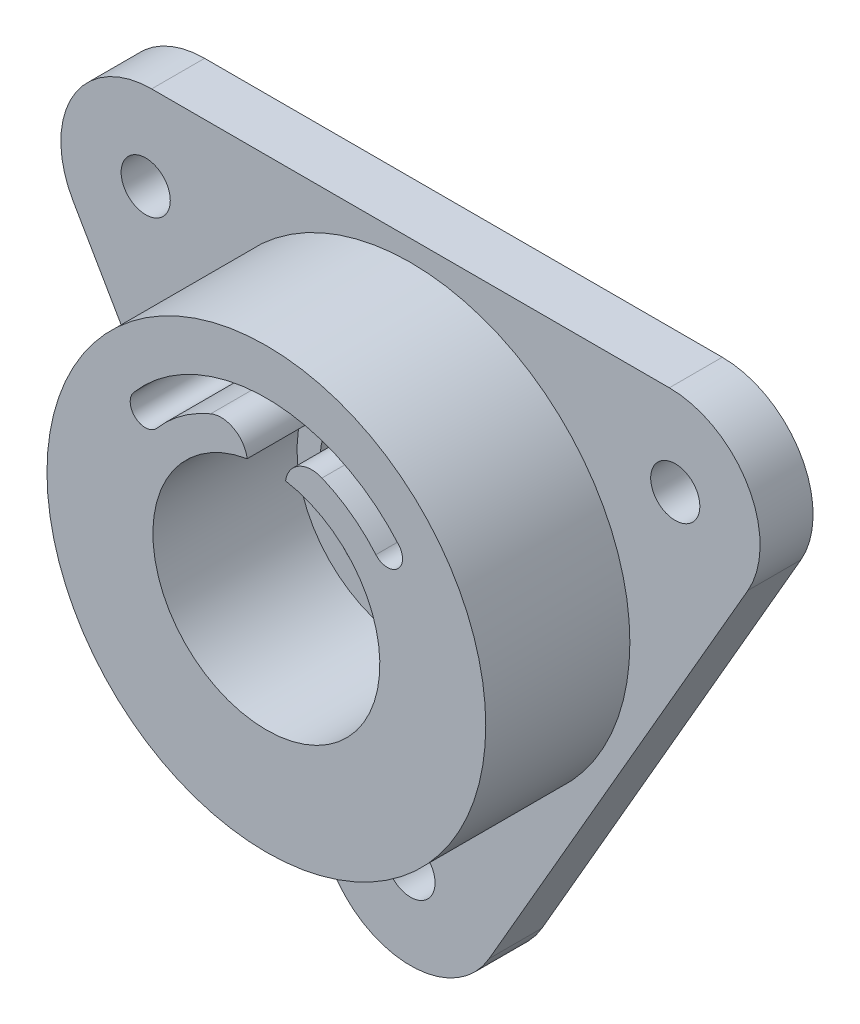
ISO-10303-21;
HEADER;
FILE_DESCRIPTION(('STEP AP214'),'2;1');
FILE_NAME('part.step','',(''),(''),'','','');
FILE_SCHEMA(('AUTOMOTIVE_DESIGN { 1 0 10303 214 1 1 1 1 }'));
ENDSEC;
DATA;
#1=APPLICATION_CONTEXT('core data for automotive mechanical design processes');
#2=APPLICATION_PROTOCOL_DEFINITION('international standard','automotive_design',2000,#1);
#3=PRODUCT_CONTEXT('',#1,'mechanical');
#4=PRODUCT('Part','Part','',(#3));
#5=PRODUCT_RELATED_PRODUCT_CATEGORY('part','',(#4));
#6=PRODUCT_DEFINITION_FORMATION('','',#4);
#7=PRODUCT_DEFINITION_CONTEXT('part definition',#1,'design');
#8=PRODUCT_DEFINITION('design','',#6,#7);
#9=PRODUCT_DEFINITION_SHAPE('','',#8);
#10=(LENGTH_UNIT() NAMED_UNIT(*) SI_UNIT(.MILLI.,.METRE.));
#11=(NAMED_UNIT(*) PLANE_ANGLE_UNIT() SI_UNIT($,.RADIAN.));
#12=(NAMED_UNIT(*) SI_UNIT($,.STERADIAN.) SOLID_ANGLE_UNIT());
#13=UNCERTAINTY_MEASURE_WITH_UNIT(LENGTH_MEASURE(1.E-05),#10,'distance_accuracy_value','');
#14=(GEOMETRIC_REPRESENTATION_CONTEXT(3) GLOBAL_UNCERTAINTY_ASSIGNED_CONTEXT((#13)) GLOBAL_UNIT_ASSIGNED_CONTEXT((#10,
#11,#12)) REPRESENTATION_CONTEXT('',''));
#15=CARTESIAN_POINT('',(0.,0.,0.));
#16=DIRECTION('',(0.,0.,1.));
#17=DIRECTION('',(1.,0.,0.));
#18=AXIS2_PLACEMENT_3D('',#15,#16,#17);
#19=CARTESIAN_POINT('',(0.,0.,0.));
#20=DIRECTION('',(0.,0.,-1.));
#21=DIRECTION('',(-1.,0.,0.));
#22=AXIS2_PLACEMENT_3D('',#19,#20,#21);
#23=PLANE('',#22);
#24=CARTESIAN_POINT('',(-17.5,10.1036297108185,0.));
#25=DIRECTION('',(0.,0.,1.));
#26=DIRECTION('',(1.,0.,0.));
#27=AXIS2_PLACEMENT_3D('',#24,#25,#26);
#28=CIRCLE('',#27,1.625);
#29=CARTESIAN_POINT('',(-15.875,10.1036297108185,0.));
#30=VERTEX_POINT('',#29);
#31=EDGE_CURVE('E182',#30,#30,#28,.T.);
#32=ORIENTED_EDGE('',*,*,#31,.T.);
#33=EDGE_LOOP('',(#32));
#34=FACE_BOUND('',#33,.T.);
#35=CARTESIAN_POINT('',(17.5,10.1036297108185,0.));
#36=DIRECTION('',(0.,0.,1.));
#37=DIRECTION('',(1.,0.,0.));
#38=AXIS2_PLACEMENT_3D('',#35,#36,#37);
#39=CIRCLE('',#38,1.625);
#40=CARTESIAN_POINT('',(19.125,10.1036297108185,0.));
#41=VERTEX_POINT('',#40);
#42=EDGE_CURVE('E201',#41,#41,#39,.T.);
#43=ORIENTED_EDGE('',*,*,#42,.T.);
#44=EDGE_LOOP('',(#43));
#45=FACE_BOUND('',#44,.T.);
#46=DIRECTION('',(-1.,0.,0.));
#47=VECTOR('',#46,1.);
#48=CARTESIAN_POINT('',(-27.5,15.8771324027147,0.));
#49=LINE('',#48,#47);
#50=CARTESIAN_POINT('',(17.1076951545867,15.8771324027147,0.));
#51=VERTEX_POINT('',#50);
#52=CARTESIAN_POINT('',(-17.1076951545867,15.8771324027147,0.));
#53=VERTEX_POINT('',#52);
#54=EDGE_CURVE('E230',#51,#53,#49,.T.);
#55=ORIENTED_EDGE('',*,*,#54,.F.);
#56=CARTESIAN_POINT('',(17.1076951545867,9.87713240271472,0.));
#57=DIRECTION('',(0.,0.,-1.));
#58=DIRECTION('',(-1.,0.,0.));
#59=AXIS2_PLACEMENT_3D('',#56,#57,#58);
#60=CIRCLE('',#59,6.);
#61=CARTESIAN_POINT('',(22.3038475772934,6.87713240271471,0.));
#62=VERTEX_POINT('',#61);
#63=EDGE_CURVE('E250',#51,#62,#60,.T.);
#64=ORIENTED_EDGE('',*,*,#63,.T.);
#65=DIRECTION('',(0.5,0.866025403784439,0.));
#66=VECTOR('',#65,1.);
#67=CARTESIAN_POINT('',(27.5,15.8771324027147,0.));
#68=LINE('',#67,#66);
#69=CARTESIAN_POINT('',(5.19615242270662,-22.7542648054294,0.));
#70=VERTEX_POINT('',#69);
#71=EDGE_CURVE('E209',#70,#62,#68,.T.);
#72=ORIENTED_EDGE('',*,*,#71,.F.);
#73=CARTESIAN_POINT('',(0.,-19.7542648054294,0.));
#74=DIRECTION('',(0.,0.,-1.));
#75=DIRECTION('',(-1.,0.,0.));
#76=AXIS2_PLACEMENT_3D('',#73,#74,#75);
#77=CIRCLE('',#76,6.);
#78=CARTESIAN_POINT('',(-5.19615242270663,-22.7542648054294,0.));
#79=VERTEX_POINT('',#78);
#80=EDGE_CURVE('E244',#70,#79,#77,.T.);
#81=ORIENTED_EDGE('',*,*,#80,.T.);
#82=DIRECTION('',(0.5,-0.866025403784439,0.));
#83=VECTOR('',#82,1.);
#84=CARTESIAN_POINT('',(0.,-31.7542648054294,0.));
#85=LINE('',#84,#83);
#86=CARTESIAN_POINT('',(-22.3038475772934,6.87713240271472,0.));
#87=VERTEX_POINT('',#86);
#88=EDGE_CURVE('E218',#87,#79,#85,.T.);
#89=ORIENTED_EDGE('',*,*,#88,.F.);
#90=CARTESIAN_POINT('',(-17.1076951545867,9.87713240271472,0.));
#91=DIRECTION('',(0.,0.,-1.));
#92=DIRECTION('',(-1.,0.,0.));
#93=AXIS2_PLACEMENT_3D('',#90,#91,#92);
#94=CIRCLE('',#93,6.);
#95=EDGE_CURVE('E247',#87,#53,#94,.T.);
#96=ORIENTED_EDGE('',*,*,#95,.T.);
#97=EDGE_LOOP('',(#55,#64,#72,#81,#89,#96));
#98=FACE_BOUND('',#97,.T.);
#99=CARTESIAN_POINT('',(0.,-20.2072594216369,0.));
#100=DIRECTION('',(0.,0.,1.));
#101=DIRECTION('',(1.,0.,0.));
#102=AXIS2_PLACEMENT_3D('',#99,#100,#101);
#103=CIRCLE('',#102,1.625);
#104=CARTESIAN_POINT('',(1.62500000000001,-20.2072594216369,0.));
#105=VERTEX_POINT('',#104);
#106=EDGE_CURVE('E193',#105,#105,#103,.T.);
#107=ORIENTED_EDGE('',*,*,#106,.T.);
#108=EDGE_LOOP('',(#107));
#109=FACE_BOUND('',#108,.T.);
#110=CARTESIAN_POINT('',(3.,7.14580296397823,0.));
#111=DIRECTION('',(0.,0.,-1.));
#112=DIRECTION('',(1.,0.,0.));
#113=AXIS2_PLACEMENT_3D('',#110,#111,#112);
#114=CIRCLE('',#113,1.75);
#115=CARTESIAN_POINT('',(2.32258064516129,5.53223455275734,0.));
#116=VERTEX_POINT('',#115);
#117=CARTESIAN_POINT('',(3.67741935483871,8.75937137519911,0.));
#118=VERTEX_POINT('',#117);
#119=EDGE_CURVE('E172',#116,#118,#114,.T.);
#120=ORIENTED_EDGE('',*,*,#119,.T.);
#121=CARTESIAN_POINT('',(0.,0.,0.));
#122=DIRECTION('',(0.,0.,-1.));
#123=DIRECTION('',(-1.,0.,0.));
#124=AXIS2_PLACEMENT_3D('',#121,#122,#123);
#125=CIRCLE('',#124,9.5);
#126=CARTESIAN_POINT('',(7.23809523809524,6.15304618252318,0.));
#127=VERTEX_POINT('',#126);
#128=EDGE_CURVE('E515',#118,#127,#125,.T.);
#129=ORIENTED_EDGE('',*,*,#128,.T.);
#130=CARTESIAN_POINT('',(8.,6.80073525436772,0.));
#131=DIRECTION('',(0.,0.,1.));
#132=DIRECTION('',(1.,0.,0.));
#133=AXIS2_PLACEMENT_3D('',#130,#131,#132);
#134=CIRCLE('',#133,1.);
#135=CARTESIAN_POINT('',(8.76190476190476,7.44842432621227,0.));
#136=VERTEX_POINT('',#135);
#137=EDGE_CURVE('E509',#127,#136,#134,.T.);
#138=ORIENTED_EDGE('',*,*,#137,.T.);
#139=CARTESIAN_POINT('',(0.,0.,0.));
#140=DIRECTION('',(0.,0.,1.));
#141=DIRECTION('',(1.,0.,0.));
#142=AXIS2_PLACEMENT_3D('',#139,#140,#141);
#143=CIRCLE('',#142,11.5);
#144=CARTESIAN_POINT('',(-8.76190476190476,7.44842432621227,0.));
#145=VERTEX_POINT('',#144);
#146=EDGE_CURVE('E484',#136,#145,#143,.T.);
#147=ORIENTED_EDGE('',*,*,#146,.T.);
#148=CARTESIAN_POINT('',(-8.,6.80073525436772,0.));
#149=DIRECTION('',(0.,0.,1.));
#150=DIRECTION('',(1.,0.,0.));
#151=AXIS2_PLACEMENT_3D('',#148,#149,#150);
#152=CIRCLE('',#151,1.);
#153=CARTESIAN_POINT('',(-7.23809523809524,6.15304618252318,0.));
#154=VERTEX_POINT('',#153);
#155=EDGE_CURVE('E499',#145,#154,#152,.T.);
#156=ORIENTED_EDGE('',*,*,#155,.T.);
#157=CARTESIAN_POINT('',(-3.67741935483871,8.75937137519911,0.));
#158=VERTEX_POINT('',#157);
#159=EDGE_CURVE('E170',#154,#158,#125,.T.);
#160=ORIENTED_EDGE('',*,*,#159,.T.);
#161=CARTESIAN_POINT('',(-3.,7.14580296397823,0.));
#162=DIRECTION('',(0.,0.,-1.));
#163=DIRECTION('',(1.,0.,0.));
#164=AXIS2_PLACEMENT_3D('',#161,#162,#163);
#165=CIRCLE('',#164,1.75);
#166=CARTESIAN_POINT('',(-2.32258064516129,5.53223455275734,0.));
#167=VERTEX_POINT('',#166);
#168=EDGE_CURVE('E55',#158,#167,#165,.T.);
#169=ORIENTED_EDGE('',*,*,#168,.T.);
#170=CARTESIAN_POINT('',(0.,0.,0.));
#171=DIRECTION('',(0.,0.,1.));
#172=DIRECTION('',(1.,0.,0.));
#173=AXIS2_PLACEMENT_3D('',#170,#171,#172);
#174=CIRCLE('',#173,6.);
#175=EDGE_CURVE('E167',#167,#116,#174,.T.);
#176=ORIENTED_EDGE('',*,*,#175,.T.);
#177=EDGE_LOOP('',(#120,#129,#138,#147,#156,#160,#169,#176));
#178=FACE_BOUND('',#177,.T.);
#179=ADVANCED_FACE('F39',(#34,#45,#98,#109,#178),#23,.T.);
#180=CARTESIAN_POINT('',(0.,0.,13.025));
#181=DIRECTION('',(0.,0.,1.));
#182=DIRECTION('',(1.,0.,0.));
#183=AXIS2_PLACEMENT_3D('',#180,#181,#182);
#184=PLANE('',#183);
#185=CARTESIAN_POINT('',(0.,0.,13.025));
#186=DIRECTION('',(0.,0.,1.));
#187=DIRECTION('',(1.,0.,0.));
#188=AXIS2_PLACEMENT_3D('',#185,#186,#187);
#189=CIRCLE('',#188,14.5);
#190=CARTESIAN_POINT('',(14.5,0.,13.025));
#191=VERTEX_POINT('',#190);
#192=EDGE_CURVE('E178',#191,#191,#189,.T.);
#193=ORIENTED_EDGE('',*,*,#192,.T.);
#194=EDGE_LOOP('',(#193));
#195=FACE_BOUND('',#194,.T.);
#196=CARTESIAN_POINT('',(3.,7.14580296397823,13.025));
#197=DIRECTION('',(0.,0.,-1.));
#198=DIRECTION('',(1.,0.,0.));
#199=AXIS2_PLACEMENT_3D('',#196,#197,#198);
#200=CIRCLE('',#199,1.75);
#201=CARTESIAN_POINT('',(1.2674235171821,7.39213349636583,13.025));
#202=VERTEX_POINT('',#201);
#203=CARTESIAN_POINT('',(3.67741935483871,8.75937137519911,13.025));
#204=VERTEX_POINT('',#203);
#205=EDGE_CURVE('E63',#202,#204,#200,.T.);
#206=ORIENTED_EDGE('',*,*,#205,.F.);
#207=CARTESIAN_POINT('',(0.,0.,13.025));
#208=DIRECTION('',(0.,0.,1.));
#209=DIRECTION('',(1.,0.,0.));
#210=AXIS2_PLACEMENT_3D('',#207,#208,#209);
#211=CIRCLE('',#210,7.5);
#212=CARTESIAN_POINT('',(-1.2674235171821,7.39213349636583,13.025));
#213=VERTEX_POINT('',#212);
#214=EDGE_CURVE('E185',#213,#202,#211,.T.);
#215=ORIENTED_EDGE('',*,*,#214,.F.);
#216=CARTESIAN_POINT('',(-3.,7.14580296397823,13.025));
#217=DIRECTION('',(0.,0.,-1.));
#218=DIRECTION('',(1.,0.,0.));
#219=AXIS2_PLACEMENT_3D('',#216,#217,#218);
#220=CIRCLE('',#219,1.75);
#221=CARTESIAN_POINT('',(-3.67741935483871,8.75937137519911,13.025));
#222=VERTEX_POINT('',#221);
#223=EDGE_CURVE('E487',#222,#213,#220,.T.);
#224=ORIENTED_EDGE('',*,*,#223,.F.);
#225=CARTESIAN_POINT('',(0.,0.,13.025));
#226=DIRECTION('',(0.,0.,-1.));
#227=DIRECTION('',(-1.,0.,0.));
#228=AXIS2_PLACEMENT_3D('',#225,#226,#227);
#229=CIRCLE('',#228,9.5);
#230=CARTESIAN_POINT('',(-7.23809523809524,6.15304618252318,13.025));
#231=VERTEX_POINT('',#230);
#232=EDGE_CURVE('E481',#231,#222,#229,.T.);
#233=ORIENTED_EDGE('',*,*,#232,.F.);
#234=CARTESIAN_POINT('',(-8.,6.80073525436772,13.025));
#235=DIRECTION('',(0.,0.,1.));
#236=DIRECTION('',(1.,0.,0.));
#237=AXIS2_PLACEMENT_3D('',#234,#235,#236);
#238=CIRCLE('',#237,1.);
#239=CARTESIAN_POINT('',(-8.76190476190476,7.44842432621227,13.025));
#240=VERTEX_POINT('',#239);
#241=EDGE_CURVE('E469',#240,#231,#238,.T.);
#242=ORIENTED_EDGE('',*,*,#241,.F.);
#243=CARTESIAN_POINT('',(0.,0.,13.025));
#244=DIRECTION('',(0.,0.,1.));
#245=DIRECTION('',(1.,0.,0.));
#246=AXIS2_PLACEMENT_3D('',#243,#244,#245);
#247=CIRCLE('',#246,11.5);
#248=CARTESIAN_POINT('',(8.76190476190476,7.44842432621227,13.025));
#249=VERTEX_POINT('',#248);
#250=EDGE_CURVE('E494',#249,#240,#247,.T.);
#251=ORIENTED_EDGE('',*,*,#250,.F.);
#252=CARTESIAN_POINT('',(8.,6.80073525436772,13.025));
#253=DIRECTION('',(0.,0.,1.));
#254=DIRECTION('',(1.,0.,0.));
#255=AXIS2_PLACEMENT_3D('',#252,#253,#254);
#256=CIRCLE('',#255,1.);
#257=CARTESIAN_POINT('',(7.23809523809524,6.15304618252318,13.025));
#258=VERTEX_POINT('',#257);
#259=EDGE_CURVE('E489',#258,#249,#256,.T.);
#260=ORIENTED_EDGE('',*,*,#259,.F.);
#261=EDGE_CURVE('E478',#204,#258,#229,.T.);
#262=ORIENTED_EDGE('',*,*,#261,.F.);
#263=EDGE_LOOP('',(#206,#215,#224,#233,#242,#251,#260,#262));
#264=FACE_BOUND('',#263,.T.);
#265=ADVANCED_FACE('F309',(#195,#264),#184,.T.);
#266=CARTESIAN_POINT('',(0.,0.,3.5));
#267=DIRECTION('',(0.,0.,-1.));
#268=DIRECTION('',(-1.,0.,0.));
#269=AXIS2_PLACEMENT_3D('',#266,#267,#268);
#270=PLANE('',#269);
#271=CARTESIAN_POINT('',(0.,0.,3.5));
#272=DIRECTION('',(0.,0.,1.));
#273=DIRECTION('',(1.,0.,0.));
#274=AXIS2_PLACEMENT_3D('',#271,#272,#273);
#275=CIRCLE('',#274,7.5);
#276=CARTESIAN_POINT('',(-1.2674235171821,7.39213349636583,3.5));
#277=VERTEX_POINT('',#276);
#278=CARTESIAN_POINT('',(1.2674235171821,7.39213349636583,3.5));
#279=VERTEX_POINT('',#278);
#280=EDGE_CURVE('E347',#277,#279,#275,.T.);
#281=ORIENTED_EDGE('',*,*,#280,.T.);
#282=CARTESIAN_POINT('',(3.,7.14580296397823,3.5));
#283=DIRECTION('',(0.,0.,-1.));
#284=DIRECTION('',(-1.,0.,0.));
#285=AXIS2_PLACEMENT_3D('',#282,#283,#284);
#286=CIRCLE('',#285,1.75);
#287=CARTESIAN_POINT('',(2.32258064516129,5.53223455275734,3.5));
#288=VERTEX_POINT('',#287);
#289=EDGE_CURVE('E348',#279,#288,#286,.F.);
#290=ORIENTED_EDGE('',*,*,#289,.T.);
#291=CARTESIAN_POINT('',(0.,0.,3.5));
#292=DIRECTION('',(0.,0.,1.));
#293=DIRECTION('',(1.,0.,0.));
#294=AXIS2_PLACEMENT_3D('',#291,#292,#293);
#295=CIRCLE('',#294,6.);
#296=CARTESIAN_POINT('',(-2.32258064516129,5.53223455275734,3.5));
#297=VERTEX_POINT('',#296);
#298=EDGE_CURVE('E177',#297,#288,#295,.T.);
#299=ORIENTED_EDGE('',*,*,#298,.F.);
#300=CARTESIAN_POINT('',(-3.,7.14580296397823,3.5));
#301=DIRECTION('',(0.,0.,-1.));
#302=DIRECTION('',(-1.,0.,0.));
#303=AXIS2_PLACEMENT_3D('',#300,#301,#302);
#304=CIRCLE('',#303,1.75);
#305=EDGE_CURVE('E154',#297,#277,#304,.F.);
#306=ORIENTED_EDGE('',*,*,#305,.T.);
#307=EDGE_LOOP('',(#281,#290,#299,#306));
#308=FACE_BOUND('',#307,.T.);
#309=ADVANCED_FACE('F315',(#308),#270,.F.);
#310=CARTESIAN_POINT('',(0.,0.,0.));
#311=DIRECTION('',(0.,0.,1.));
#312=DIRECTION('',(1.,0.,0.));
#313=AXIS2_PLACEMENT_3D('',#310,#311,#312);
#314=CYLINDRICAL_SURFACE('',#313,9.5);
#315=DIRECTION('',(0.,0.,1.));
#316=VECTOR('',#315,1.);
#317=CARTESIAN_POINT('',(-3.67741935483871,8.75937137519911,0.));
#318=LINE('',#317,#316);
#319=EDGE_CURVE('E161',#158,#222,#318,.T.);
#320=ORIENTED_EDGE('',*,*,#319,.F.);
#321=ORIENTED_EDGE('',*,*,#159,.F.);
#322=DIRECTION('',(0.,0.,1.));
#323=VECTOR('',#322,1.);
#324=CARTESIAN_POINT('',(-7.23809523809524,6.15304618252318,0.));
#325=LINE('',#324,#323);
#326=EDGE_CURVE('E472',#154,#231,#325,.T.);
#327=ORIENTED_EDGE('',*,*,#326,.T.);
#328=ORIENTED_EDGE('',*,*,#232,.T.);
#329=EDGE_LOOP('',(#320,#321,#327,#328));
#330=FACE_BOUND('',#329,.T.);
#331=ADVANCED_FACE('F331',(#330),#314,.T.);
#332=CARTESIAN_POINT('',(0.,0.,3.5));
#333=DIRECTION('',(0.,0.,1.));
#334=DIRECTION('',(1.,0.,0.));
#335=AXIS2_PLACEMENT_3D('',#332,#333,#334);
#336=CIRCLE('',#335,14.5);
#337=CARTESIAN_POINT('',(14.5,0.,3.5));
#338=VERTEX_POINT('',#337);
#339=EDGE_CURVE('E226',#338,#338,#336,.T.);
#340=ORIENTED_EDGE('',*,*,#339,.F.);
#341=EDGE_LOOP('',(#340));
#342=FACE_BOUND('',#341,.T.);
#343=DIRECTION('',(0.5,0.866025403784439,0.));
#344=VECTOR('',#343,1.);
#345=CARTESIAN_POINT('',(27.5,15.8771324027147,3.5));
#346=LINE('',#345,#344);
#347=CARTESIAN_POINT('',(5.19615242270662,-22.7542648054294,3.5));
#348=VERTEX_POINT('',#347);
#349=CARTESIAN_POINT('',(22.3038475772934,6.87713240271471,3.5));
#350=VERTEX_POINT('',#349);
#351=EDGE_CURVE('E213',#348,#350,#346,.T.);
#352=ORIENTED_EDGE('',*,*,#351,.T.);
#353=CARTESIAN_POINT('',(17.1076951545867,9.87713240271472,3.5));
#354=DIRECTION('',(0.,0.,-1.));
#355=DIRECTION('',(-1.,0.,0.));
#356=AXIS2_PLACEMENT_3D('',#353,#354,#355);
#357=CIRCLE('',#356,6.);
#358=CARTESIAN_POINT('',(17.1076951545867,15.8771324027147,3.5));
#359=VERTEX_POINT('',#358);
#360=EDGE_CURVE('E266',#350,#359,#357,.F.);
#361=ORIENTED_EDGE('',*,*,#360,.T.);
#362=DIRECTION('',(-1.,0.,0.));
#363=VECTOR('',#362,1.);
#364=CARTESIAN_POINT('',(-27.5,15.8771324027147,3.5));
#365=LINE('',#364,#363);
#366=CARTESIAN_POINT('',(-17.1076951545867,15.8771324027147,3.5));
#367=VERTEX_POINT('',#366);
#368=EDGE_CURVE('E217',#359,#367,#365,.T.);
#369=ORIENTED_EDGE('',*,*,#368,.T.);
#370=CARTESIAN_POINT('',(-17.1076951545867,9.87713240271472,3.5));
#371=DIRECTION('',(0.,0.,-1.));
#372=DIRECTION('',(-1.,0.,0.));
#373=AXIS2_PLACEMENT_3D('',#370,#371,#372);
#374=CIRCLE('',#373,6.);
#375=CARTESIAN_POINT('',(-22.3038475772934,6.87713240271472,3.5));
#376=VERTEX_POINT('',#375);
#377=EDGE_CURVE('E263',#367,#376,#374,.F.);
#378=ORIENTED_EDGE('',*,*,#377,.T.);
#379=DIRECTION('',(0.5,-0.866025403784439,0.));
#380=VECTOR('',#379,1.);
#381=CARTESIAN_POINT('',(0.,-31.7542648054294,3.5));
#382=LINE('',#381,#380);
#383=CARTESIAN_POINT('',(-5.19615242270663,-22.7542648054294,3.5));
#384=VERTEX_POINT('',#383);
#385=EDGE_CURVE('E222',#376,#384,#382,.T.);
#386=ORIENTED_EDGE('',*,*,#385,.T.);
#387=CARTESIAN_POINT('',(0.,-19.7542648054294,3.5));
#388=DIRECTION('',(0.,0.,-1.));
#389=DIRECTION('',(-1.,0.,0.));
#390=AXIS2_PLACEMENT_3D('',#387,#388,#389);
#391=CIRCLE('',#390,6.);
#392=EDGE_CURVE('E260',#384,#348,#391,.F.);
#393=ORIENTED_EDGE('',*,*,#392,.T.);
#394=EDGE_LOOP('',(#352,#361,#369,#378,#386,#393));
#395=FACE_BOUND('',#394,.T.);
#396=CARTESIAN_POINT('',(17.5,10.1036297108185,3.5));
#397=DIRECTION('',(0.,0.,1.));
#398=DIRECTION('',(1.,0.,0.));
#399=AXIS2_PLACEMENT_3D('',#396,#397,#398);
#400=CIRCLE('',#399,1.625);
#401=CARTESIAN_POINT('',(19.125,10.1036297108185,3.5));
#402=VERTEX_POINT('',#401);
#403=EDGE_CURVE('E205',#402,#402,#400,.T.);
#404=ORIENTED_EDGE('',*,*,#403,.F.);
#405=EDGE_LOOP('',(#404));
#406=FACE_BOUND('',#405,.T.);
#407=CARTESIAN_POINT('',(0.,-20.2072594216369,3.5));
#408=DIRECTION('',(0.,0.,1.));
#409=DIRECTION('',(1.,0.,0.));
#410=AXIS2_PLACEMENT_3D('',#407,#408,#409);
#411=CIRCLE('',#410,1.625);
#412=CARTESIAN_POINT('',(1.62500000000001,-20.2072594216369,3.5));
#413=VERTEX_POINT('',#412);
#414=EDGE_CURVE('E197',#413,#413,#411,.T.);
#415=ORIENTED_EDGE('',*,*,#414,.F.);
#416=EDGE_LOOP('',(#415));
#417=FACE_BOUND('',#416,.T.);
#418=CARTESIAN_POINT('',(-17.5,10.1036297108185,3.5));
#419=DIRECTION('',(0.,0.,1.));
#420=DIRECTION('',(1.,0.,0.));
#421=AXIS2_PLACEMENT_3D('',#418,#419,#420);
#422=CIRCLE('',#421,1.625);
#423=CARTESIAN_POINT('',(-15.875,10.1036297108185,3.5));
#424=VERTEX_POINT('',#423);
#425=EDGE_CURVE('E189',#424,#424,#422,.T.);
#426=ORIENTED_EDGE('',*,*,#425,.F.);
#427=EDGE_LOOP('',(#426));
#428=FACE_BOUND('',#427,.T.);
#429=ADVANCED_FACE('F278',(#342,#395,#406,#417,#428),#270,.F.);
#430=CARTESIAN_POINT('',(27.5,15.8771324027147,3.5));
#431=DIRECTION('',(-0.866025403784439,0.5,0.));
#432=DIRECTION('',(-0.5,-0.866025403784439,0.));
#433=AXIS2_PLACEMENT_3D('',#430,#431,#432);
#434=PLANE('',#433);
#435=ORIENTED_EDGE('',*,*,#71,.T.);
#436=DIRECTION('',(0.,0.,-1.));
#437=VECTOR('',#436,1.);
#438=CARTESIAN_POINT('',(22.3038475772934,6.87713240271471,3.5));
#439=LINE('',#438,#437);
#440=EDGE_CURVE('E257',#62,#350,#439,.F.);
#441=ORIENTED_EDGE('',*,*,#440,.T.);
#442=ORIENTED_EDGE('',*,*,#351,.F.);
#443=DIRECTION('',(0.,0.,-1.));
#444=VECTOR('',#443,1.);
#445=CARTESIAN_POINT('',(5.19615242270662,-22.7542648054294,3.5));
#446=LINE('',#445,#444);
#447=EDGE_CURVE('E253',#348,#70,#446,.T.);
#448=ORIENTED_EDGE('',*,*,#447,.T.);
#449=EDGE_LOOP('',(#435,#441,#442,#448));
#450=FACE_BOUND('',#449,.T.);
#451=ADVANCED_FACE('F285',(#450),#434,.F.);
#452=CARTESIAN_POINT('',(-27.5,15.8771324027147,3.5));
#453=DIRECTION('',(0.,-1.,0.));
#454=DIRECTION('',(0.,0.,-1.));
#455=AXIS2_PLACEMENT_3D('',#452,#453,#454);
#456=PLANE('',#455);
#457=ORIENTED_EDGE('',*,*,#368,.F.);
#458=DIRECTION('',(0.,0.,-1.));
#459=VECTOR('',#458,1.);
#460=CARTESIAN_POINT('',(17.1076951545867,15.8771324027147,3.5));
#461=LINE('',#460,#459);
#462=EDGE_CURVE('E240',#359,#51,#461,.T.);
#463=ORIENTED_EDGE('',*,*,#462,.T.);
#464=ORIENTED_EDGE('',*,*,#54,.T.);
#465=DIRECTION('',(0.,0.,-1.));
#466=VECTOR('',#465,1.);
#467=CARTESIAN_POINT('',(-17.1076951545867,15.8771324027147,3.5));
#468=LINE('',#467,#466);
#469=EDGE_CURVE('E237',#53,#367,#468,.F.);
#470=ORIENTED_EDGE('',*,*,#469,.T.);
#471=EDGE_LOOP('',(#457,#463,#464,#470));
#472=FACE_BOUND('',#471,.T.);
#473=ADVANCED_FACE('F296',(#472),#456,.F.);
#474=CARTESIAN_POINT('',(0.,-31.7542648054294,3.5));
#475=DIRECTION('',(0.866025403784439,0.5,0.));
#476=DIRECTION('',(-0.5,0.866025403784439,0.));
#477=AXIS2_PLACEMENT_3D('',#474,#475,#476);
#478=PLANE('',#477);
#479=ORIENTED_EDGE('',*,*,#385,.F.);
#480=DIRECTION('',(0.,0.,-1.));
#481=VECTOR('',#480,1.);
#482=CARTESIAN_POINT('',(-22.3038475772934,6.87713240271472,3.5));
#483=LINE('',#482,#481);
#484=EDGE_CURVE('E11',#376,#87,#483,.T.);
#485=ORIENTED_EDGE('',*,*,#484,.T.);
#486=ORIENTED_EDGE('',*,*,#88,.T.);
#487=DIRECTION('',(0.,0.,-1.));
#488=VECTOR('',#487,1.);
#489=CARTESIAN_POINT('',(-5.19615242270663,-22.7542648054294,3.5));
#490=LINE('',#489,#488);
#491=EDGE_CURVE('E48',#79,#384,#490,.F.);
#492=ORIENTED_EDGE('',*,*,#491,.T.);
#493=EDGE_LOOP('',(#479,#485,#486,#492));
#494=FACE_BOUND('',#493,.T.);
#495=ADVANCED_FACE('F272',(#494),#478,.F.);
#496=CARTESIAN_POINT('',(17.5,10.1036297108185,3.5));
#497=DIRECTION('',(0.,0.,-1.));
#498=DIRECTION('',(-1.,0.,0.));
#499=AXIS2_PLACEMENT_3D('',#496,#497,#498);
#500=CYLINDRICAL_SURFACE('',#499,1.625);
#501=ORIENTED_EDGE('',*,*,#403,.T.);
#502=EDGE_LOOP('',(#501));
#503=FACE_BOUND('',#502,.T.);
#504=ORIENTED_EDGE('',*,*,#42,.F.);
#505=EDGE_LOOP('',(#504));
#506=FACE_BOUND('',#505,.T.);
#507=ADVANCED_FACE('F324',(#503,#506),#500,.F.);
#508=CARTESIAN_POINT('',(0.,-20.2072594216369,3.5));
#509=DIRECTION('',(0.,0.,-1.));
#510=DIRECTION('',(-1.,0.,0.));
#511=AXIS2_PLACEMENT_3D('',#508,#509,#510);
#512=CYLINDRICAL_SURFACE('',#511,1.625);
#513=ORIENTED_EDGE('',*,*,#414,.T.);
#514=EDGE_LOOP('',(#513));
#515=FACE_BOUND('',#514,.T.);
#516=ORIENTED_EDGE('',*,*,#106,.F.);
#517=EDGE_LOOP('',(#516));
#518=FACE_BOUND('',#517,.T.);
#519=ADVANCED_FACE('F380',(#515,#518),#512,.F.);
#520=CARTESIAN_POINT('',(-17.5,10.1036297108185,3.5));
#521=DIRECTION('',(0.,0.,-1.));
#522=DIRECTION('',(-1.,0.,0.));
#523=AXIS2_PLACEMENT_3D('',#520,#521,#522);
#524=CYLINDRICAL_SURFACE('',#523,1.625);
#525=ORIENTED_EDGE('',*,*,#425,.T.);
#526=EDGE_LOOP('',(#525));
#527=FACE_BOUND('',#526,.T.);
#528=ORIENTED_EDGE('',*,*,#31,.F.);
#529=EDGE_LOOP('',(#528));
#530=FACE_BOUND('',#529,.T.);
#531=ADVANCED_FACE('F374',(#527,#530),#524,.F.);
#532=CARTESIAN_POINT('',(0.,0.,3.5));
#533=DIRECTION('',(0.,0.,-1.));
#534=DIRECTION('',(-1.,0.,0.));
#535=AXIS2_PLACEMENT_3D('',#532,#533,#534);
#536=CYLINDRICAL_SURFACE('',#535,6.);
#537=DIRECTION('',(0.,0.,1.));
#538=VECTOR('',#537,1.);
#539=CARTESIAN_POINT('',(2.32258064516129,5.53223455275734,0.));
#540=LINE('',#539,#538);
#541=EDGE_CURVE('E160',#116,#288,#540,.T.);
#542=ORIENTED_EDGE('',*,*,#541,.F.);
#543=ORIENTED_EDGE('',*,*,#175,.F.);
#544=DIRECTION('',(0.,0.,1.));
#545=VECTOR('',#544,1.);
#546=CARTESIAN_POINT('',(-2.32258064516129,5.53223455275734,0.));
#547=LINE('',#546,#545);
#548=EDGE_CURVE('E151',#167,#297,#547,.T.);
#549=ORIENTED_EDGE('',*,*,#548,.T.);
#550=ORIENTED_EDGE('',*,*,#298,.T.);
#551=EDGE_LOOP('',(#542,#543,#549,#550));
#552=FACE_BOUND('',#551,.T.);
#553=ADVANCED_FACE('F175',(#552),#536,.F.);
#554=CARTESIAN_POINT('',(0.,0.,13.025));
#555=DIRECTION('',(0.,0.,-1.));
#556=DIRECTION('',(-1.,0.,0.));
#557=AXIS2_PLACEMENT_3D('',#554,#555,#556);
#558=CYLINDRICAL_SURFACE('',#557,14.5);
#559=ORIENTED_EDGE('',*,*,#192,.F.);
#560=EDGE_LOOP('',(#559));
#561=FACE_BOUND('',#560,.T.);
#562=ORIENTED_EDGE('',*,*,#339,.T.);
#563=EDGE_LOOP('',(#562));
#564=FACE_BOUND('',#563,.T.);
#565=ADVANCED_FACE('F365',(#561,#564),#558,.T.);
#566=CARTESIAN_POINT('',(0.,0.,13.025));
#567=DIRECTION('',(0.,0.,-1.));
#568=DIRECTION('',(-1.,0.,0.));
#569=AXIS2_PLACEMENT_3D('',#566,#567,#568);
#570=CYLINDRICAL_SURFACE('',#569,7.5);
#571=DIRECTION('',(0.,0.,1.));
#572=VECTOR('',#571,1.);
#573=CARTESIAN_POINT('',(1.2674235171821,7.39213349636583,6.5125));
#574=LINE('',#573,#572);
#575=EDGE_CURVE('E525',#279,#202,#574,.T.);
#576=ORIENTED_EDGE('',*,*,#575,.F.);
#577=ORIENTED_EDGE('',*,*,#280,.F.);
#578=DIRECTION('',(0.,0.,1.));
#579=VECTOR('',#578,1.);
#580=CARTESIAN_POINT('',(-1.2674235171821,7.39213349636583,6.5125));
#581=LINE('',#580,#579);
#582=EDGE_CURVE('E530',#213,#277,#581,.F.);
#583=ORIENTED_EDGE('',*,*,#582,.F.);
#584=ORIENTED_EDGE('',*,*,#214,.T.);
#585=EDGE_LOOP('',(#576,#577,#583,#584));
#586=FACE_BOUND('',#585,.T.);
#587=ADVANCED_FACE('F306',(#586),#570,.F.);
#588=CARTESIAN_POINT('',(17.1076951545867,9.87713240271472,3.5));
#589=DIRECTION('',(0.,0.,-1.));
#590=DIRECTION('',(-1.,0.,0.));
#591=AXIS2_PLACEMENT_3D('',#588,#589,#590);
#592=CYLINDRICAL_SURFACE('',#591,6.);
#593=ORIENTED_EDGE('',*,*,#360,.F.);
#594=ORIENTED_EDGE('',*,*,#440,.F.);
#595=ORIENTED_EDGE('',*,*,#63,.F.);
#596=ORIENTED_EDGE('',*,*,#462,.F.);
#597=EDGE_LOOP('',(#593,#594,#595,#596));
#598=FACE_BOUND('',#597,.T.);
#599=ADVANCED_FACE('F293',(#598),#592,.T.);
#600=CARTESIAN_POINT('',(-17.1076951545867,9.87713240271472,3.5));
#601=DIRECTION('',(0.,0.,-1.));
#602=DIRECTION('',(-1.,0.,0.));
#603=AXIS2_PLACEMENT_3D('',#600,#601,#602);
#604=CYLINDRICAL_SURFACE('',#603,6.);
#605=ORIENTED_EDGE('',*,*,#377,.F.);
#606=ORIENTED_EDGE('',*,*,#469,.F.);
#607=ORIENTED_EDGE('',*,*,#95,.F.);
#608=ORIENTED_EDGE('',*,*,#484,.F.);
#609=EDGE_LOOP('',(#605,#606,#607,#608));
#610=FACE_BOUND('',#609,.T.);
#611=ADVANCED_FACE('F299',(#610),#604,.T.);
#612=CARTESIAN_POINT('',(0.,-19.7542648054294,3.5));
#613=DIRECTION('',(0.,0.,-1.));
#614=DIRECTION('',(-1.,0.,0.));
#615=AXIS2_PLACEMENT_3D('',#612,#613,#614);
#616=CYLINDRICAL_SURFACE('',#615,6.);
#617=ORIENTED_EDGE('',*,*,#392,.F.);
#618=ORIENTED_EDGE('',*,*,#491,.F.);
#619=ORIENTED_EDGE('',*,*,#80,.F.);
#620=ORIENTED_EDGE('',*,*,#447,.F.);
#621=EDGE_LOOP('',(#617,#618,#619,#620));
#622=FACE_BOUND('',#621,.T.);
#623=ADVANCED_FACE('F41',(#622),#616,.T.);
#624=CARTESIAN_POINT('',(-8.,6.80073525436772,0.));
#625=DIRECTION('',(0.,0.,1.));
#626=DIRECTION('',(1.,0.,0.));
#627=AXIS2_PLACEMENT_3D('',#624,#625,#626);
#628=CYLINDRICAL_SURFACE('',#627,1.);
#629=ORIENTED_EDGE('',*,*,#241,.T.);
#630=ORIENTED_EDGE('',*,*,#326,.F.);
#631=ORIENTED_EDGE('',*,*,#155,.F.);
#632=DIRECTION('',(0.,0.,1.));
#633=VECTOR('',#632,1.);
#634=CARTESIAN_POINT('',(-8.76190476190476,7.44842432621227,0.));
#635=LINE('',#634,#633);
#636=EDGE_CURVE('E353',#145,#240,#635,.T.);
#637=ORIENTED_EDGE('',*,*,#636,.T.);
#638=EDGE_LOOP('',(#629,#630,#631,#637));
#639=FACE_BOUND('',#638,.T.);
#640=ADVANCED_FACE('F305',(#639),#628,.F.);
#641=CARTESIAN_POINT('',(0.,0.,0.));
#642=DIRECTION('',(0.,0.,1.));
#643=DIRECTION('',(1.,0.,0.));
#644=AXIS2_PLACEMENT_3D('',#641,#642,#643);
#645=CYLINDRICAL_SURFACE('',#644,11.5);
#646=ORIENTED_EDGE('',*,*,#250,.T.);
#647=ORIENTED_EDGE('',*,*,#636,.F.);
#648=ORIENTED_EDGE('',*,*,#146,.F.);
#649=DIRECTION('',(0.,0.,1.));
#650=VECTOR('',#649,1.);
#651=CARTESIAN_POINT('',(8.76190476190476,7.44842432621227,0.));
#652=LINE('',#651,#650);
#653=EDGE_CURVE('E359',#136,#249,#652,.T.);
#654=ORIENTED_EDGE('',*,*,#653,.T.);
#655=EDGE_LOOP('',(#646,#647,#648,#654));
#656=FACE_BOUND('',#655,.T.);
#657=ADVANCED_FACE('F458',(#656),#645,.F.);
#658=CARTESIAN_POINT('',(8.,6.80073525436772,0.));
#659=DIRECTION('',(0.,0.,1.));
#660=DIRECTION('',(1.,0.,0.));
#661=AXIS2_PLACEMENT_3D('',#658,#659,#660);
#662=CYLINDRICAL_SURFACE('',#661,1.);
#663=ORIENTED_EDGE('',*,*,#259,.T.);
#664=ORIENTED_EDGE('',*,*,#653,.F.);
#665=ORIENTED_EDGE('',*,*,#137,.F.);
#666=DIRECTION('',(0.,0.,1.));
#667=VECTOR('',#666,1.);
#668=CARTESIAN_POINT('',(7.23809523809524,6.15304618252318,0.));
#669=LINE('',#668,#667);
#670=EDGE_CURVE('E483',#127,#258,#669,.T.);
#671=ORIENTED_EDGE('',*,*,#670,.T.);
#672=EDGE_LOOP('',(#663,#664,#665,#671));
#673=FACE_BOUND('',#672,.T.);
#674=ADVANCED_FACE('F433',(#673),#662,.F.);
#675=ORIENTED_EDGE('',*,*,#128,.F.);
#676=DIRECTION('',(0.,0.,1.));
#677=VECTOR('',#676,1.);
#678=CARTESIAN_POINT('',(3.67741935483871,8.75937137519911,0.));
#679=LINE('',#678,#677);
#680=EDGE_CURVE('E533',#118,#204,#679,.T.);
#681=ORIENTED_EDGE('',*,*,#680,.T.);
#682=ORIENTED_EDGE('',*,*,#261,.T.);
#683=ORIENTED_EDGE('',*,*,#670,.F.);
#684=EDGE_LOOP('',(#675,#681,#682,#683));
#685=FACE_BOUND('',#684,.T.);
#686=ADVANCED_FACE('F338',(#685),#314,.T.);
#687=CARTESIAN_POINT('',(-3.,7.14580296397823,0.));
#688=DIRECTION('',(0.,0.,1.));
#689=DIRECTION('',(1.,0.,0.));
#690=AXIS2_PLACEMENT_3D('',#687,#688,#689);
#691=CYLINDRICAL_SURFACE('',#690,1.75);
#692=ORIENTED_EDGE('',*,*,#548,.F.);
#693=ORIENTED_EDGE('',*,*,#168,.F.);
#694=ORIENTED_EDGE('',*,*,#319,.T.);
#695=ORIENTED_EDGE('',*,*,#223,.T.);
#696=ORIENTED_EDGE('',*,*,#582,.T.);
#697=ORIENTED_EDGE('',*,*,#305,.F.);
#698=EDGE_LOOP('',(#692,#693,#694,#695,#696,#697));
#699=FACE_BOUND('',#698,.T.);
#700=ADVANCED_FACE('F152',(#699),#691,.T.);
#701=CARTESIAN_POINT('',(3.,7.14580296397823,0.));
#702=DIRECTION('',(0.,0.,1.));
#703=DIRECTION('',(1.,0.,0.));
#704=AXIS2_PLACEMENT_3D('',#701,#702,#703);
#705=CYLINDRICAL_SURFACE('',#704,1.75);
#706=ORIENTED_EDGE('',*,*,#575,.T.);
#707=ORIENTED_EDGE('',*,*,#205,.T.);
#708=ORIENTED_EDGE('',*,*,#680,.F.);
#709=ORIENTED_EDGE('',*,*,#119,.F.);
#710=ORIENTED_EDGE('',*,*,#541,.T.);
#711=ORIENTED_EDGE('',*,*,#289,.F.);
#712=EDGE_LOOP('',(#706,#707,#708,#709,#710,#711));
#713=FACE_BOUND('',#712,.T.);
#714=ADVANCED_FACE('F444',(#713),#705,.T.);
#715=CLOSED_SHELL('',(#179,#265,#309,#331,#429,#451,#473,#495,#507,#519,#531,#553,#565,#587,
#599,#611,#623,#640,#657,#674,#686,#700,#714));
#716=MANIFOLD_SOLID_BREP('B2',#715);
#717=ADVANCED_BREP_SHAPE_REPRESENTATION('',(#18,#716),#14);
#718=SHAPE_DEFINITION_REPRESENTATION(#9,#717);
ENDSEC;
END-ISO-10303-21;
